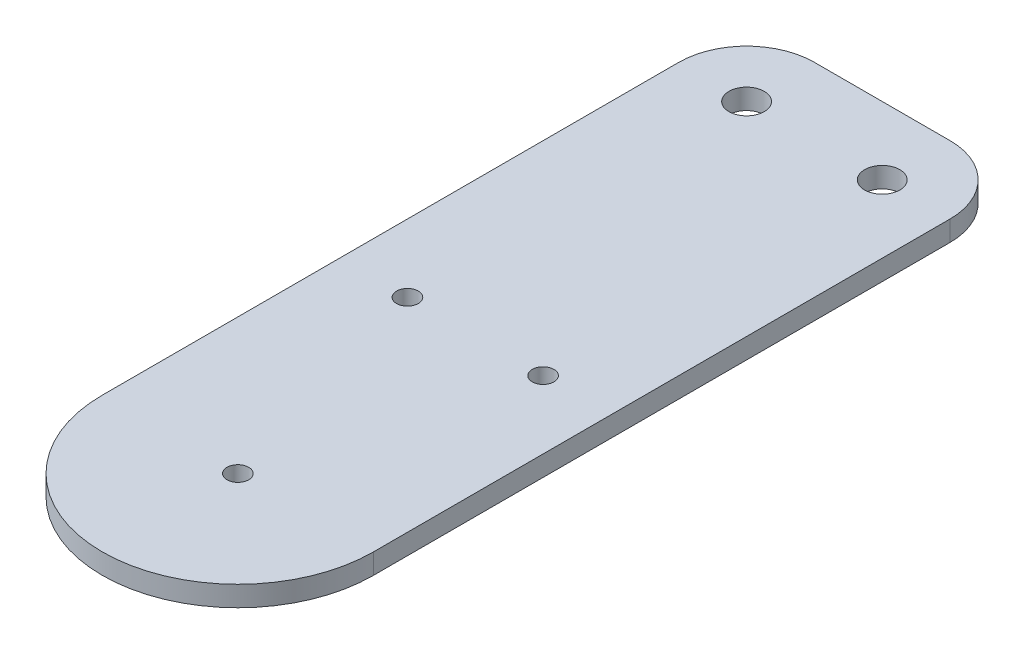
ISO-10303-21;
HEADER;
FILE_DESCRIPTION(('STEP AP214'),'2;1');
FILE_NAME('part.step','',(''),(''),'','','');
FILE_SCHEMA(('AUTOMOTIVE_DESIGN { 1 0 10303 214 1 1 1 1 }'));
ENDSEC;
DATA;
#1=APPLICATION_CONTEXT('core data for automotive mechanical design processes');
#2=APPLICATION_PROTOCOL_DEFINITION('international standard','automotive_design',2000,#1);
#3=PRODUCT_CONTEXT('',#1,'mechanical');
#4=PRODUCT('Part','Part','',(#3));
#5=PRODUCT_RELATED_PRODUCT_CATEGORY('part','',(#4));
#6=PRODUCT_DEFINITION_FORMATION('','',#4);
#7=PRODUCT_DEFINITION_CONTEXT('part definition',#1,'design');
#8=PRODUCT_DEFINITION('design','',#6,#7);
#9=PRODUCT_DEFINITION_SHAPE('','',#8);
#10=(LENGTH_UNIT() NAMED_UNIT(*) SI_UNIT(.MILLI.,.METRE.));
#11=(NAMED_UNIT(*) PLANE_ANGLE_UNIT() SI_UNIT($,.RADIAN.));
#12=(NAMED_UNIT(*) SI_UNIT($,.STERADIAN.) SOLID_ANGLE_UNIT());
#13=UNCERTAINTY_MEASURE_WITH_UNIT(LENGTH_MEASURE(1.E-05),#10,'distance_accuracy_value','');
#14=(GEOMETRIC_REPRESENTATION_CONTEXT(3) GLOBAL_UNCERTAINTY_ASSIGNED_CONTEXT((#13)) GLOBAL_UNIT_ASSIGNED_CONTEXT((#10,
#11,#12)) REPRESENTATION_CONTEXT('',''));
#15=CARTESIAN_POINT('',(0.,0.,0.));
#16=DIRECTION('',(0.,0.,1.));
#17=DIRECTION('',(1.,0.,0.));
#18=AXIS2_PLACEMENT_3D('',#15,#16,#17);
#19=CARTESIAN_POINT('',(0.,3.,0.));
#20=DIRECTION('',(-1.,0.,0.));
#21=DIRECTION('',(0.,0.,1.));
#22=AXIS2_PLACEMENT_3D('',#19,#20,#21);
#23=PLANE('',#22);
#24=DIRECTION('',(0.,0.,-1.));
#25=VECTOR('',#24,1.);
#26=CARTESIAN_POINT('',(0.,3.,0.));
#27=LINE('',#26,#25);
#28=CARTESIAN_POINT('',(0.,3.,0.));
#29=VERTEX_POINT('',#28);
#30=CARTESIAN_POINT('',(0.,3.,-85.));
#31=VERTEX_POINT('',#30);
#32=EDGE_CURVE('E103',#29,#31,#27,.T.);
#33=ORIENTED_EDGE('',*,*,#32,.T.);
#34=DIRECTION('',(0.,-1.,0.));
#35=VECTOR('',#34,1.);
#36=CARTESIAN_POINT('',(0.,3.,-85.));
#37=LINE('',#36,#35);
#38=CARTESIAN_POINT('',(0.,0.,-85.));
#39=VERTEX_POINT('',#38);
#40=EDGE_CURVE('E11',#31,#39,#37,.T.);
#41=ORIENTED_EDGE('',*,*,#40,.T.);
#42=DIRECTION('',(0.,0.,-1.));
#43=VECTOR('',#42,1.);
#44=CARTESIAN_POINT('',(0.,0.,0.));
#45=LINE('',#44,#43);
#46=CARTESIAN_POINT('',(0.,0.,0.));
#47=VERTEX_POINT('',#46);
#48=EDGE_CURVE('E106',#47,#39,#45,.T.);
#49=ORIENTED_EDGE('',*,*,#48,.F.);
#50=DIRECTION('',(0.,-1.,0.));
#51=VECTOR('',#50,1.);
#52=CARTESIAN_POINT('',(0.,3.,0.));
#53=LINE('',#52,#51);
#54=EDGE_CURVE('E101',#29,#47,#53,.T.);
#55=ORIENTED_EDGE('',*,*,#54,.F.);
#56=EDGE_LOOP('',(#33,#41,#49,#55));
#57=FACE_BOUND('',#56,.T.);
#58=ADVANCED_FACE('F45',(#57),#23,.T.);
#59=CARTESIAN_POINT('',(20.,3.,0.));
#60=DIRECTION('',(0.,-1.,0.));
#61=DIRECTION('',(0.,0.,-1.));
#62=AXIS2_PLACEMENT_3D('',#59,#60,#61);
#63=CYLINDRICAL_SURFACE('',#62,20.);
#64=CARTESIAN_POINT('',(20.,0.,0.));
#65=DIRECTION('',(0.,1.,0.));
#66=DIRECTION('',(0.,0.,1.));
#67=AXIS2_PLACEMENT_3D('',#64,#65,#66);
#68=CIRCLE('',#67,20.);
#69=CARTESIAN_POINT('',(40.,0.,0.));
#70=VERTEX_POINT('',#69);
#71=EDGE_CURVE('E145',#47,#70,#68,.T.);
#72=ORIENTED_EDGE('',*,*,#71,.T.);
#73=DIRECTION('',(0.,-1.,0.));
#74=VECTOR('',#73,1.);
#75=CARTESIAN_POINT('',(40.,3.,0.));
#76=LINE('',#75,#74);
#77=CARTESIAN_POINT('',(40.,3.,0.));
#78=VERTEX_POINT('',#77);
#79=EDGE_CURVE('E112',#78,#70,#76,.T.);
#80=ORIENTED_EDGE('',*,*,#79,.F.);
#81=CARTESIAN_POINT('',(20.,3.,0.));
#82=DIRECTION('',(0.,1.,0.));
#83=DIRECTION('',(0.,0.,1.));
#84=AXIS2_PLACEMENT_3D('',#81,#82,#83);
#85=CIRCLE('',#84,20.);
#86=EDGE_CURVE('E116',#29,#78,#85,.T.);
#87=ORIENTED_EDGE('',*,*,#86,.F.);
#88=ORIENTED_EDGE('',*,*,#54,.T.);
#89=EDGE_LOOP('',(#72,#80,#87,#88));
#90=FACE_BOUND('',#89,.T.);
#91=ADVANCED_FACE('F117',(#90),#63,.T.);
#92=CARTESIAN_POINT('',(40.,3.,0.));
#93=DIRECTION('',(-1.,0.,0.));
#94=DIRECTION('',(0.,0.,1.));
#95=AXIS2_PLACEMENT_3D('',#92,#93,#94);
#96=PLANE('',#95);
#97=DIRECTION('',(0.,0.,-1.));
#98=VECTOR('',#97,1.);
#99=CARTESIAN_POINT('',(40.,0.,0.));
#100=LINE('',#99,#98);
#101=CARTESIAN_POINT('',(40.,0.,-85.));
#102=VERTEX_POINT('',#101);
#103=EDGE_CURVE('E148',#70,#102,#100,.T.);
#104=ORIENTED_EDGE('',*,*,#103,.T.);
#105=DIRECTION('',(0.,-1.,0.));
#106=VECTOR('',#105,1.);
#107=CARTESIAN_POINT('',(40.,3.,-85.));
#108=LINE('',#107,#106);
#109=CARTESIAN_POINT('',(40.,3.,-85.));
#110=VERTEX_POINT('',#109);
#111=EDGE_CURVE('E69',#102,#110,#108,.F.);
#112=ORIENTED_EDGE('',*,*,#111,.T.);
#113=DIRECTION('',(0.,0.,-1.));
#114=VECTOR('',#113,1.);
#115=CARTESIAN_POINT('',(40.,3.,0.));
#116=LINE('',#115,#114);
#117=EDGE_CURVE('E120',#78,#110,#116,.T.);
#118=ORIENTED_EDGE('',*,*,#117,.F.);
#119=ORIENTED_EDGE('',*,*,#79,.T.);
#120=EDGE_LOOP('',(#104,#112,#118,#119));
#121=FACE_BOUND('',#120,.T.);
#122=ADVANCED_FACE('F182',(#121),#96,.F.);
#123=CARTESIAN_POINT('',(20.,3.,0.));
#124=DIRECTION('',(0.,-1.,0.));
#125=DIRECTION('',(0.,0.,-1.));
#126=AXIS2_PLACEMENT_3D('',#123,#124,#125);
#127=CYLINDRICAL_SURFACE('',#126,1.6);
#128=CARTESIAN_POINT('',(20.,3.,0.));
#129=DIRECTION('',(0.,1.,0.));
#130=DIRECTION('',(0.,0.,1.));
#131=AXIS2_PLACEMENT_3D('',#128,#129,#130);
#132=CIRCLE('',#131,1.6);
#133=CARTESIAN_POINT('',(20.,3.,1.60000000000001));
#134=VERTEX_POINT('',#133);
#135=EDGE_CURVE('E124',#134,#134,#132,.T.);
#136=ORIENTED_EDGE('',*,*,#135,.T.);
#137=EDGE_LOOP('',(#136));
#138=FACE_BOUND('',#137,.T.);
#139=CARTESIAN_POINT('',(20.,0.,0.));
#140=DIRECTION('',(0.,1.,0.));
#141=DIRECTION('',(0.,0.,1.));
#142=AXIS2_PLACEMENT_3D('',#139,#140,#141);
#143=CIRCLE('',#142,1.6);
#144=CARTESIAN_POINT('',(20.,0.,1.60000000000001));
#145=VERTEX_POINT('',#144);
#146=EDGE_CURVE('E138',#145,#145,#143,.T.);
#147=ORIENTED_EDGE('',*,*,#146,.F.);
#148=EDGE_LOOP('',(#147));
#149=FACE_BOUND('',#148,.T.);
#150=ADVANCED_FACE('F197',(#138,#149),#127,.F.);
#151=CARTESIAN_POINT('',(0.,3.,-95.));
#152=DIRECTION('',(0.,0.,-1.));
#153=DIRECTION('',(-1.,0.,0.));
#154=AXIS2_PLACEMENT_3D('',#151,#152,#153);
#155=PLANE('',#154);
#156=DIRECTION('',(1.,0.,0.));
#157=VECTOR('',#156,1.);
#158=CARTESIAN_POINT('',(0.,3.,-95.));
#159=LINE('',#158,#157);
#160=CARTESIAN_POINT('',(10.,3.,-95.));
#161=VERTEX_POINT('',#160);
#162=CARTESIAN_POINT('',(30.,3.,-95.));
#163=VERTEX_POINT('',#162);
#164=EDGE_CURVE('E134',#161,#163,#159,.T.);
#165=ORIENTED_EDGE('',*,*,#164,.T.);
#166=DIRECTION('',(0.,-1.,0.));
#167=VECTOR('',#166,1.);
#168=CARTESIAN_POINT('',(30.,0.,-95.));
#169=LINE('',#168,#167);
#170=CARTESIAN_POINT('',(30.,0.,-95.));
#171=VERTEX_POINT('',#170);
#172=EDGE_CURVE('E158',#163,#171,#169,.T.);
#173=ORIENTED_EDGE('',*,*,#172,.T.);
#174=DIRECTION('',(1.,0.,0.));
#175=VECTOR('',#174,1.);
#176=CARTESIAN_POINT('',(0.,0.,-95.));
#177=LINE('',#176,#175);
#178=CARTESIAN_POINT('',(10.,0.,-95.));
#179=VERTEX_POINT('',#178);
#180=EDGE_CURVE('E128',#179,#171,#177,.T.);
#181=ORIENTED_EDGE('',*,*,#180,.F.);
#182=DIRECTION('',(0.,-1.,0.));
#183=VECTOR('',#182,1.);
#184=CARTESIAN_POINT('',(10.,3.,-95.));
#185=LINE('',#184,#183);
#186=EDGE_CURVE('E111',#179,#161,#185,.F.);
#187=ORIENTED_EDGE('',*,*,#186,.T.);
#188=EDGE_LOOP('',(#165,#173,#181,#187));
#189=FACE_BOUND('',#188,.T.);
#190=ADVANCED_FACE('F176',(#189),#155,.T.);
#191=CARTESIAN_POINT('',(0.,3.,0.));
#192=DIRECTION('',(0.,1.,0.));
#193=DIRECTION('',(0.,0.,1.));
#194=AXIS2_PLACEMENT_3D('',#191,#192,#193);
#195=PLANE('',#194);
#196=CARTESIAN_POINT('',(30.,3.,-85.));
#197=DIRECTION('',(0.,1.,0.));
#198=DIRECTION('',(0.,0.,1.));
#199=AXIS2_PLACEMENT_3D('',#196,#197,#198);
#200=CIRCLE('',#199,2.6);
#201=CARTESIAN_POINT('',(30.,3.,-82.4));
#202=VERTEX_POINT('',#201);
#203=EDGE_CURVE('E254',#202,#202,#200,.T.);
#204=ORIENTED_EDGE('',*,*,#203,.F.);
#205=EDGE_LOOP('',(#204));
#206=FACE_BOUND('',#205,.T.);
#207=CARTESIAN_POINT('',(10.,3.,-35.));
#208=DIRECTION('',(0.,1.,0.));
#209=DIRECTION('',(0.,0.,1.));
#210=AXIS2_PLACEMENT_3D('',#207,#208,#209);
#211=CIRCLE('',#210,1.6);
#212=CARTESIAN_POINT('',(10.,3.,-33.4));
#213=VERTEX_POINT('',#212);
#214=EDGE_CURVE('E250',#213,#213,#211,.T.);
#215=ORIENTED_EDGE('',*,*,#214,.F.);
#216=EDGE_LOOP('',(#215));
#217=FACE_BOUND('',#216,.T.);
#218=CARTESIAN_POINT('',(30.,3.,-35.));
#219=DIRECTION('',(0.,1.,0.));
#220=DIRECTION('',(0.,0.,1.));
#221=AXIS2_PLACEMENT_3D('',#218,#219,#220);
#222=CIRCLE('',#221,1.6);
#223=CARTESIAN_POINT('',(30.,3.,-33.4));
#224=VERTEX_POINT('',#223);
#225=EDGE_CURVE('E242',#224,#224,#222,.T.);
#226=ORIENTED_EDGE('',*,*,#225,.F.);
#227=EDGE_LOOP('',(#226));
#228=FACE_BOUND('',#227,.T.);
#229=CARTESIAN_POINT('',(10.,3.,-85.));
#230=DIRECTION('',(0.,1.,0.));
#231=DIRECTION('',(0.,0.,1.));
#232=AXIS2_PLACEMENT_3D('',#229,#230,#231);
#233=CIRCLE('',#232,2.6);
#234=CARTESIAN_POINT('',(10.,3.,-82.4));
#235=VERTEX_POINT('',#234);
#236=EDGE_CURVE('E258',#235,#235,#233,.T.);
#237=ORIENTED_EDGE('',*,*,#236,.F.);
#238=EDGE_LOOP('',(#237));
#239=FACE_BOUND('',#238,.T.);
#240=ORIENTED_EDGE('',*,*,#135,.F.);
#241=EDGE_LOOP('',(#240));
#242=FACE_BOUND('',#241,.T.);
#243=ORIENTED_EDGE('',*,*,#117,.T.);
#244=CARTESIAN_POINT('',(30.,3.,-85.));
#245=DIRECTION('',(0.,1.,0.));
#246=DIRECTION('',(0.,0.,1.));
#247=AXIS2_PLACEMENT_3D('',#244,#245,#246);
#248=CIRCLE('',#247,10.);
#249=EDGE_CURVE('E54',#110,#163,#248,.T.);
#250=ORIENTED_EDGE('',*,*,#249,.T.);
#251=ORIENTED_EDGE('',*,*,#164,.F.);
#252=CARTESIAN_POINT('',(10.,3.,-85.));
#253=DIRECTION('',(0.,1.,0.));
#254=DIRECTION('',(0.,0.,1.));
#255=AXIS2_PLACEMENT_3D('',#252,#253,#254);
#256=CIRCLE('',#255,10.);
#257=EDGE_CURVE('E61',#161,#31,#256,.T.);
#258=ORIENTED_EDGE('',*,*,#257,.T.);
#259=ORIENTED_EDGE('',*,*,#32,.F.);
#260=ORIENTED_EDGE('',*,*,#86,.T.);
#261=EDGE_LOOP('',(#243,#250,#251,#258,#259,#260));
#262=FACE_BOUND('',#261,.T.);
#263=ADVANCED_FACE('F122',(#206,#217,#228,#239,#242,#262),#195,.T.);
#264=CARTESIAN_POINT('',(0.,0.,0.));
#265=DIRECTION('',(0.,1.,0.));
#266=DIRECTION('',(0.,0.,1.));
#267=AXIS2_PLACEMENT_3D('',#264,#265,#266);
#268=PLANE('',#267);
#269=CARTESIAN_POINT('',(30.,0.,-85.));
#270=DIRECTION('',(0.,1.,0.));
#271=DIRECTION('',(0.,0.,1.));
#272=AXIS2_PLACEMENT_3D('',#269,#270,#271);
#273=CIRCLE('',#272,2.6);
#274=CARTESIAN_POINT('',(30.,0.,-82.4));
#275=VERTEX_POINT('',#274);
#276=EDGE_CURVE('E259',#275,#275,#273,.T.);
#277=ORIENTED_EDGE('',*,*,#276,.T.);
#278=EDGE_LOOP('',(#277));
#279=FACE_BOUND('',#278,.T.);
#280=CARTESIAN_POINT('',(10.,0.,-35.));
#281=DIRECTION('',(0.,1.,0.));
#282=DIRECTION('',(0.,0.,1.));
#283=AXIS2_PLACEMENT_3D('',#280,#281,#282);
#284=CIRCLE('',#283,1.6);
#285=CARTESIAN_POINT('',(10.,0.,-33.4));
#286=VERTEX_POINT('',#285);
#287=EDGE_CURVE('E245',#286,#286,#284,.T.);
#288=ORIENTED_EDGE('',*,*,#287,.T.);
#289=EDGE_LOOP('',(#288));
#290=FACE_BOUND('',#289,.T.);
#291=CARTESIAN_POINT('',(30.,0.,-35.));
#292=DIRECTION('',(0.,1.,0.));
#293=DIRECTION('',(0.,0.,1.));
#294=AXIS2_PLACEMENT_3D('',#291,#292,#293);
#295=CIRCLE('',#294,1.6);
#296=CARTESIAN_POINT('',(30.,0.,-33.4));
#297=VERTEX_POINT('',#296);
#298=EDGE_CURVE('E239',#297,#297,#295,.T.);
#299=ORIENTED_EDGE('',*,*,#298,.T.);
#300=EDGE_LOOP('',(#299));
#301=FACE_BOUND('',#300,.T.);
#302=CARTESIAN_POINT('',(10.,0.,-85.));
#303=DIRECTION('',(0.,1.,0.));
#304=DIRECTION('',(0.,0.,1.));
#305=AXIS2_PLACEMENT_3D('',#302,#303,#304);
#306=CIRCLE('',#305,2.6);
#307=CARTESIAN_POINT('',(10.,0.,-82.4));
#308=VERTEX_POINT('',#307);
#309=EDGE_CURVE('E142',#308,#308,#306,.T.);
#310=ORIENTED_EDGE('',*,*,#309,.T.);
#311=EDGE_LOOP('',(#310));
#312=FACE_BOUND('',#311,.T.);
#313=ORIENTED_EDGE('',*,*,#146,.T.);
#314=EDGE_LOOP('',(#313));
#315=FACE_BOUND('',#314,.T.);
#316=ORIENTED_EDGE('',*,*,#180,.T.);
#317=CARTESIAN_POINT('',(30.,0.,-85.));
#318=DIRECTION('',(0.,1.,0.));
#319=DIRECTION('',(0.,0.,1.));
#320=AXIS2_PLACEMENT_3D('',#317,#318,#319);
#321=CIRCLE('',#320,10.);
#322=EDGE_CURVE('E165',#171,#102,#321,.F.);
#323=ORIENTED_EDGE('',*,*,#322,.T.);
#324=ORIENTED_EDGE('',*,*,#103,.F.);
#325=ORIENTED_EDGE('',*,*,#71,.F.);
#326=ORIENTED_EDGE('',*,*,#48,.T.);
#327=CARTESIAN_POINT('',(10.,0.,-85.));
#328=DIRECTION('',(0.,1.,0.));
#329=DIRECTION('',(0.,0.,1.));
#330=AXIS2_PLACEMENT_3D('',#327,#328,#329);
#331=CIRCLE('',#330,10.);
#332=EDGE_CURVE('E162',#39,#179,#331,.F.);
#333=ORIENTED_EDGE('',*,*,#332,.T.);
#334=EDGE_LOOP('',(#316,#323,#324,#325,#326,#333));
#335=FACE_BOUND('',#334,.T.);
#336=ADVANCED_FACE('F181',(#279,#290,#301,#312,#315,#335),#268,.F.);
#337=CARTESIAN_POINT('',(10.,0.,-85.));
#338=DIRECTION('',(0.,1.,0.));
#339=DIRECTION('',(0.,0.,1.));
#340=AXIS2_PLACEMENT_3D('',#337,#338,#339);
#341=CYLINDRICAL_SURFACE('',#340,2.6);
#342=ORIENTED_EDGE('',*,*,#309,.F.);
#343=EDGE_LOOP('',(#342));
#344=FACE_BOUND('',#343,.T.);
#345=ORIENTED_EDGE('',*,*,#236,.T.);
#346=EDGE_LOOP('',(#345));
#347=FACE_BOUND('',#346,.T.);
#348=ADVANCED_FACE('F210',(#344,#347),#341,.F.);
#349=CARTESIAN_POINT('',(30.,0.,-35.));
#350=DIRECTION('',(0.,1.,0.));
#351=DIRECTION('',(0.,0.,1.));
#352=AXIS2_PLACEMENT_3D('',#349,#350,#351);
#353=CYLINDRICAL_SURFACE('',#352,1.6);
#354=ORIENTED_EDGE('',*,*,#298,.F.);
#355=EDGE_LOOP('',(#354));
#356=FACE_BOUND('',#355,.T.);
#357=ORIENTED_EDGE('',*,*,#225,.T.);
#358=EDGE_LOOP('',(#357));
#359=FACE_BOUND('',#358,.T.);
#360=ADVANCED_FACE('F217',(#356,#359),#353,.F.);
#361=CARTESIAN_POINT('',(10.,0.,-35.));
#362=DIRECTION('',(0.,1.,0.));
#363=DIRECTION('',(0.,0.,1.));
#364=AXIS2_PLACEMENT_3D('',#361,#362,#363);
#365=CYLINDRICAL_SURFACE('',#364,1.6);
#366=ORIENTED_EDGE('',*,*,#287,.F.);
#367=EDGE_LOOP('',(#366));
#368=FACE_BOUND('',#367,.T.);
#369=ORIENTED_EDGE('',*,*,#214,.T.);
#370=EDGE_LOOP('',(#369));
#371=FACE_BOUND('',#370,.T.);
#372=ADVANCED_FACE('F225',(#368,#371),#365,.F.);
#373=CARTESIAN_POINT('',(30.,0.,-85.));
#374=DIRECTION('',(0.,1.,0.));
#375=DIRECTION('',(0.,0.,1.));
#376=AXIS2_PLACEMENT_3D('',#373,#374,#375);
#377=CYLINDRICAL_SURFACE('',#376,2.6);
#378=ORIENTED_EDGE('',*,*,#276,.F.);
#379=EDGE_LOOP('',(#378));
#380=FACE_BOUND('',#379,.T.);
#381=ORIENTED_EDGE('',*,*,#203,.T.);
#382=EDGE_LOOP('',(#381));
#383=FACE_BOUND('',#382,.T.);
#384=ADVANCED_FACE('F188',(#380,#383),#377,.F.);
#385=CARTESIAN_POINT('',(30.,3.,-85.));
#386=DIRECTION('',(0.,1.,0.));
#387=DIRECTION('',(0.,0.,1.));
#388=AXIS2_PLACEMENT_3D('',#385,#386,#387);
#389=CYLINDRICAL_SURFACE('',#388,10.);
#390=ORIENTED_EDGE('',*,*,#249,.F.);
#391=ORIENTED_EDGE('',*,*,#111,.F.);
#392=ORIENTED_EDGE('',*,*,#322,.F.);
#393=ORIENTED_EDGE('',*,*,#172,.F.);
#394=EDGE_LOOP('',(#390,#391,#392,#393));
#395=FACE_BOUND('',#394,.T.);
#396=ADVANCED_FACE('F179',(#395),#389,.T.);
#397=CARTESIAN_POINT('',(10.,3.,-85.));
#398=DIRECTION('',(0.,-1.,0.));
#399=DIRECTION('',(0.,0.,-1.));
#400=AXIS2_PLACEMENT_3D('',#397,#398,#399);
#401=CYLINDRICAL_SURFACE('',#400,10.);
#402=ORIENTED_EDGE('',*,*,#257,.F.);
#403=ORIENTED_EDGE('',*,*,#186,.F.);
#404=ORIENTED_EDGE('',*,*,#332,.F.);
#405=ORIENTED_EDGE('',*,*,#40,.F.);
#406=EDGE_LOOP('',(#402,#403,#404,#405));
#407=FACE_BOUND('',#406,.T.);
#408=ADVANCED_FACE('F47',(#407),#401,.T.);
#409=CLOSED_SHELL('',(#58,#91,#122,#150,#190,#263,#336,#348,#360,#372,#384,#396,#408));
#410=MANIFOLD_SOLID_BREP('B2',#409);
#411=ADVANCED_BREP_SHAPE_REPRESENTATION('',(#18,#410),#14);
#412=SHAPE_DEFINITION_REPRESENTATION(#9,#411);
ENDSEC;
END-ISO-10303-21;
